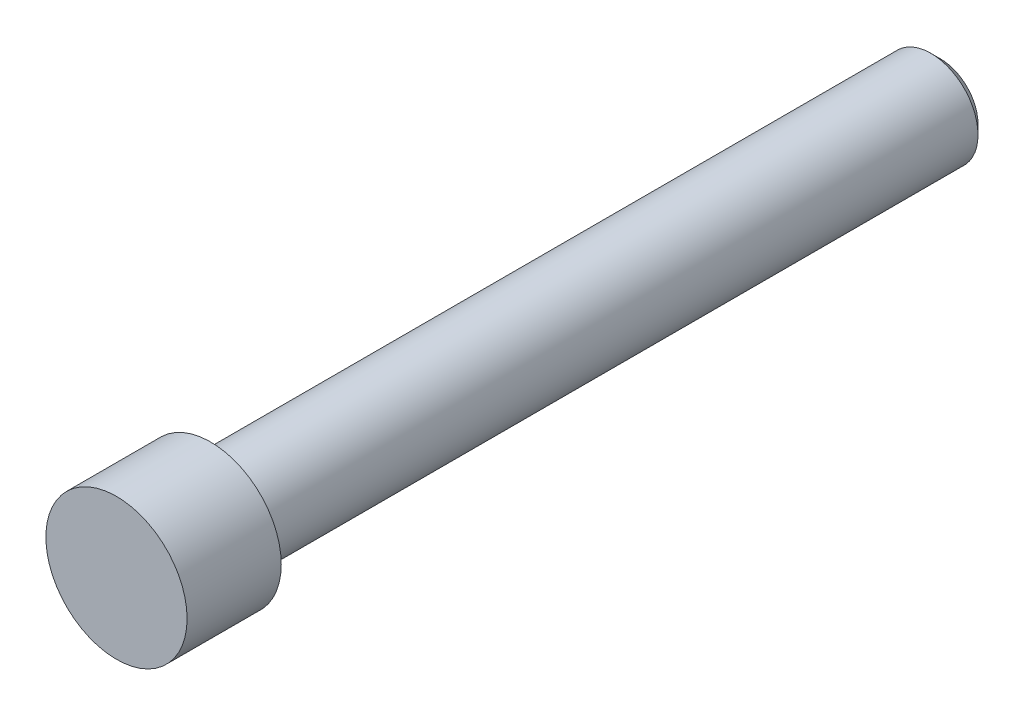
ISO-10303-21;
HEADER;
FILE_DESCRIPTION(('STEP AP214'),'2;1');
FILE_NAME('part.step','',(''),(''),'','','');
FILE_SCHEMA(('AUTOMOTIVE_DESIGN { 1 0 10303 214 1 1 1 1 }'));
ENDSEC;
DATA;
#1=APPLICATION_CONTEXT('core data for automotive mechanical design processes');
#2=APPLICATION_PROTOCOL_DEFINITION('international standard','automotive_design',2000,#1);
#3=PRODUCT_CONTEXT('',#1,'mechanical');
#4=PRODUCT('Part','Part','',(#3));
#5=PRODUCT_RELATED_PRODUCT_CATEGORY('part','',(#4));
#6=PRODUCT_DEFINITION_FORMATION('','',#4);
#7=PRODUCT_DEFINITION_CONTEXT('part definition',#1,'design');
#8=PRODUCT_DEFINITION('design','',#6,#7);
#9=PRODUCT_DEFINITION_SHAPE('','',#8);
#10=(LENGTH_UNIT() NAMED_UNIT(*) SI_UNIT(.MILLI.,.METRE.));
#11=(NAMED_UNIT(*) PLANE_ANGLE_UNIT() SI_UNIT($,.RADIAN.));
#12=(NAMED_UNIT(*) SI_UNIT($,.STERADIAN.) SOLID_ANGLE_UNIT());
#13=UNCERTAINTY_MEASURE_WITH_UNIT(LENGTH_MEASURE(1.E-05),#10,'distance_accuracy_value','');
#14=(GEOMETRIC_REPRESENTATION_CONTEXT(3) GLOBAL_UNCERTAINTY_ASSIGNED_CONTEXT((#13)) GLOBAL_UNIT_ASSIGNED_CONTEXT((#10,
#11,#12)) REPRESENTATION_CONTEXT('',''));
#15=CARTESIAN_POINT('',(0.,0.,0.));
#16=DIRECTION('',(0.,0.,1.));
#17=DIRECTION('',(1.,0.,0.));
#18=AXIS2_PLACEMENT_3D('',#15,#16,#17);
#19=CARTESIAN_POINT('',(0.,0.,15.5));
#20=DIRECTION('',(0.,0.,-1.));
#21=DIRECTION('',(-1.,0.,0.));
#22=AXIS2_PLACEMENT_3D('',#19,#20,#21);
#23=CYLINDRICAL_SURFACE('',#22,1.);
#24=CARTESIAN_POINT('',(0.,0.,0.200000000000001));
#25=DIRECTION('',(0.,0.,1.));
#26=DIRECTION('',(1.,0.,0.));
#27=AXIS2_PLACEMENT_3D('',#24,#25,#26);
#28=CIRCLE('',#27,1.);
#29=CARTESIAN_POINT('',(1.,0.,0.200000000000001));
#30=VERTEX_POINT('',#29);
#31=EDGE_CURVE('E52',#30,#30,#28,.T.);
#32=ORIENTED_EDGE('',*,*,#31,.T.);
#33=EDGE_LOOP('',(#32));
#34=FACE_BOUND('',#33,.T.);
#35=CARTESIAN_POINT('',(0.,0.,15.5));
#36=DIRECTION('',(0.,0.,1.));
#37=DIRECTION('',(1.,0.,0.));
#38=AXIS2_PLACEMENT_3D('',#35,#36,#37);
#39=CIRCLE('',#38,1.);
#40=CARTESIAN_POINT('',(1.,0.,15.5));
#41=VERTEX_POINT('',#40);
#42=EDGE_CURVE('E57',#41,#41,#39,.T.);
#43=ORIENTED_EDGE('',*,*,#42,.F.);
#44=EDGE_LOOP('',(#43));
#45=FACE_BOUND('',#44,.T.);
#46=ADVANCED_FACE('F43',(#34,#45),#23,.T.);
#47=CARTESIAN_POINT('',(0.,0.,0.));
#48=DIRECTION('',(0.,0.,1.));
#49=DIRECTION('',(1.,0.,0.));
#50=AXIS2_PLACEMENT_3D('',#47,#48,#49);
#51=PLANE('',#50);
#52=CARTESIAN_POINT('',(0.,0.,0.));
#53=DIRECTION('',(0.,0.,1.));
#54=DIRECTION('',(1.,0.,0.));
#55=AXIS2_PLACEMENT_3D('',#52,#53,#54);
#56=CIRCLE('',#55,0.8);
#57=CARTESIAN_POINT('',(0.8,0.,0.));
#58=VERTEX_POINT('',#57);
#59=EDGE_CURVE('E10',#58,#58,#56,.F.);
#60=ORIENTED_EDGE('',*,*,#59,.T.);
#61=EDGE_LOOP('',(#60));
#62=FACE_BOUND('',#61,.T.);
#63=ADVANCED_FACE('F78',(#62),#51,.F.);
#64=CARTESIAN_POINT('',(0.,0.,17.5));
#65=DIRECTION('',(0.,0.,-1.));
#66=DIRECTION('',(-1.,0.,0.));
#67=AXIS2_PLACEMENT_3D('',#64,#65,#66);
#68=CYLINDRICAL_SURFACE('',#67,1.5);
#69=CARTESIAN_POINT('',(0.,0.,17.5));
#70=DIRECTION('',(0.,0.,1.));
#71=DIRECTION('',(1.,0.,0.));
#72=AXIS2_PLACEMENT_3D('',#69,#70,#71);
#73=CIRCLE('',#72,1.5);
#74=CARTESIAN_POINT('',(1.5,0.,17.5));
#75=VERTEX_POINT('',#74);
#76=EDGE_CURVE('E62',#75,#75,#73,.T.);
#77=ORIENTED_EDGE('',*,*,#76,.F.);
#78=EDGE_LOOP('',(#77));
#79=FACE_BOUND('',#78,.T.);
#80=CARTESIAN_POINT('',(0.,0.,15.5));
#81=DIRECTION('',(0.,0.,1.));
#82=DIRECTION('',(1.,0.,0.));
#83=AXIS2_PLACEMENT_3D('',#80,#81,#82);
#84=CIRCLE('',#83,1.5);
#85=CARTESIAN_POINT('',(1.5,0.,15.5));
#86=VERTEX_POINT('',#85);
#87=EDGE_CURVE('E65',#86,#86,#84,.T.);
#88=ORIENTED_EDGE('',*,*,#87,.T.);
#89=EDGE_LOOP('',(#88));
#90=FACE_BOUND('',#89,.T.);
#91=ADVANCED_FACE('F75',(#79,#90),#68,.T.);
#92=CARTESIAN_POINT('',(0.,0.,17.5));
#93=DIRECTION('',(0.,0.,1.));
#94=DIRECTION('',(1.,0.,0.));
#95=AXIS2_PLACEMENT_3D('',#92,#93,#94);
#96=PLANE('',#95);
#97=ORIENTED_EDGE('',*,*,#76,.T.);
#98=EDGE_LOOP('',(#97));
#99=FACE_BOUND('',#98,.T.);
#100=ADVANCED_FACE('F73',(#99),#96,.T.);
#101=CARTESIAN_POINT('',(0.,0.,15.5));
#102=DIRECTION('',(0.,0.,1.));
#103=DIRECTION('',(1.,0.,0.));
#104=AXIS2_PLACEMENT_3D('',#101,#102,#103);
#105=PLANE('',#104);
#106=ORIENTED_EDGE('',*,*,#42,.T.);
#107=EDGE_LOOP('',(#106));
#108=FACE_BOUND('',#107,.T.);
#109=ORIENTED_EDGE('',*,*,#87,.F.);
#110=EDGE_LOOP('',(#109));
#111=FACE_BOUND('',#110,.T.);
#112=ADVANCED_FACE('F82',(#108,#111),#105,.F.);
#113=CARTESIAN_POINT('',(0.,0.,0.200000000000001));
#114=DIRECTION('',(0.,0.,1.));
#115=DIRECTION('',(1.,0.,0.));
#116=AXIS2_PLACEMENT_3D('',#113,#114,#115);
#117=CONICAL_SURFACE('',#116,1.,0.785398163397447);
#118=ORIENTED_EDGE('',*,*,#59,.F.);
#119=EDGE_LOOP('',(#118));
#120=FACE_BOUND('',#119,.T.);
#121=ORIENTED_EDGE('',*,*,#31,.F.);
#122=EDGE_LOOP('',(#121));
#123=FACE_BOUND('',#122,.T.);
#124=ADVANCED_FACE('F46',(#120,#123),#117,.T.);
#125=CLOSED_SHELL('',(#46,#63,#91,#100,#112,#124));
#126=MANIFOLD_SOLID_BREP('B2',#125);
#127=ADVANCED_BREP_SHAPE_REPRESENTATION('',(#18,#126),#14);
#128=SHAPE_DEFINITION_REPRESENTATION(#9,#127);
ENDSEC;
END-ISO-10303-21;
